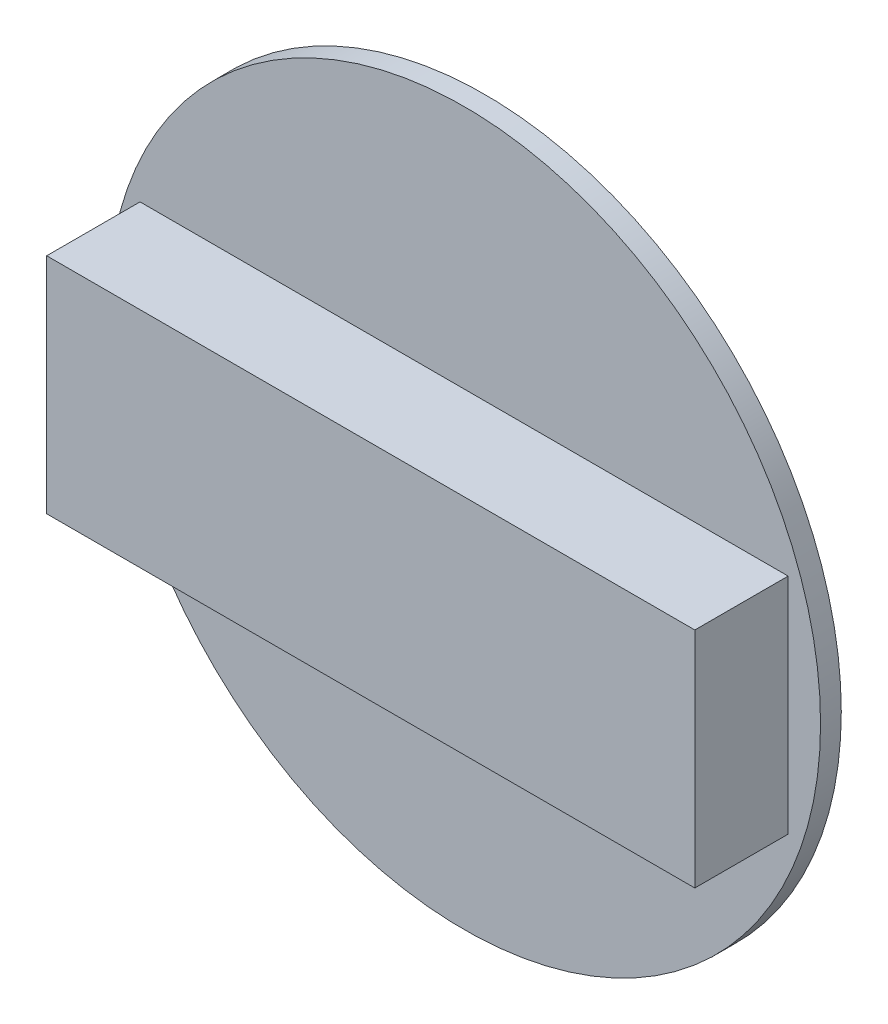
ISO-10303-21;
HEADER;
FILE_DESCRIPTION(('STEP AP214'),'2;1');
FILE_NAME('part.step','',(''),(''),'','','');
FILE_SCHEMA(('AUTOMOTIVE_DESIGN { 1 0 10303 214 1 1 1 1 }'));
ENDSEC;
DATA;
#1=APPLICATION_CONTEXT('core data for automotive mechanical design processes');
#2=APPLICATION_PROTOCOL_DEFINITION('international standard','automotive_design',2000,#1);
#3=PRODUCT_CONTEXT('',#1,'mechanical');
#4=PRODUCT('Part','Part','',(#3));
#5=PRODUCT_RELATED_PRODUCT_CATEGORY('part','',(#4));
#6=PRODUCT_DEFINITION_FORMATION('','',#4);
#7=PRODUCT_DEFINITION_CONTEXT('part definition',#1,'design');
#8=PRODUCT_DEFINITION('design','',#6,#7);
#9=PRODUCT_DEFINITION_SHAPE('','',#8);
#10=(LENGTH_UNIT() NAMED_UNIT(*) SI_UNIT(.MILLI.,.METRE.));
#11=(NAMED_UNIT(*) PLANE_ANGLE_UNIT() SI_UNIT($,.RADIAN.));
#12=(NAMED_UNIT(*) SI_UNIT($,.STERADIAN.) SOLID_ANGLE_UNIT());
#13=UNCERTAINTY_MEASURE_WITH_UNIT(LENGTH_MEASURE(1.E-05),#10,'distance_accuracy_value','');
#14=(GEOMETRIC_REPRESENTATION_CONTEXT(3) GLOBAL_UNCERTAINTY_ASSIGNED_CONTEXT((#13)) GLOBAL_UNIT_ASSIGNED_CONTEXT((#10,
#11,#12)) REPRESENTATION_CONTEXT('',''));
#15=CARTESIAN_POINT('',(0.,0.,0.));
#16=DIRECTION('',(0.,0.,1.));
#17=DIRECTION('',(1.,0.,0.));
#18=AXIS2_PLACEMENT_3D('',#15,#16,#17);
#19=CARTESIAN_POINT('',(0.,0.,1.6));
#20=DIRECTION('',(0.,0.,-1.));
#21=DIRECTION('',(-1.,0.,0.));
#22=AXIS2_PLACEMENT_3D('',#19,#20,#21);
#23=CYLINDRICAL_SURFACE('',#22,27.5);
#24=CARTESIAN_POINT('',(0.,0.,0.));
#25=DIRECTION('',(0.,0.,1.));
#26=DIRECTION('',(1.,0.,0.));
#27=AXIS2_PLACEMENT_3D('',#24,#25,#26);
#28=CIRCLE('',#27,27.5);
#29=CARTESIAN_POINT('',(-27.4431230001252,-1.76776695296639,0.));
#30=VERTEX_POINT('',#29);
#31=CARTESIAN_POINT('',(-27.4431230001252,1.76776695296635,0.));
#32=VERTEX_POINT('',#31);
#33=EDGE_CURVE('E45',#30,#32,#28,.T.);
#34=ORIENTED_EDGE('',*,*,#33,.T.);
#35=DIRECTION('',(0.,0.,1.));
#36=VECTOR('',#35,1.);
#37=CARTESIAN_POINT('',(-27.4431230001252,1.76776695296635,0.));
#38=LINE('',#37,#36);
#39=CARTESIAN_POINT('',(-27.4431230001252,1.76776695296635,1.6));
#40=VERTEX_POINT('',#39);
#41=EDGE_CURVE('E151',#32,#40,#38,.T.);
#42=ORIENTED_EDGE('',*,*,#41,.T.);
#43=CARTESIAN_POINT('',(0.,0.,1.6));
#44=DIRECTION('',(0.,0.,1.));
#45=DIRECTION('',(1.,0.,0.));
#46=AXIS2_PLACEMENT_3D('',#43,#44,#45);
#47=CIRCLE('',#46,27.5);
#48=CARTESIAN_POINT('',(-27.4431230001252,-1.76776695296639,1.6));
#49=VERTEX_POINT('',#48);
#50=EDGE_CURVE('E11',#49,#40,#47,.T.);
#51=ORIENTED_EDGE('',*,*,#50,.F.);
#52=DIRECTION('',(0.,0.,1.));
#53=VECTOR('',#52,1.);
#54=CARTESIAN_POINT('',(-27.4431230001252,-1.76776695296639,0.));
#55=LINE('',#54,#53);
#56=EDGE_CURVE('E109',#30,#49,#55,.T.);
#57=ORIENTED_EDGE('',*,*,#56,.F.);
#58=EDGE_LOOP('',(#34,#42,#51,#57));
#59=FACE_BOUND('',#58,.T.);
#60=ADVANCED_FACE('F42',(#59),#23,.T.);
#61=CARTESIAN_POINT('',(0.,0.,1.6));
#62=DIRECTION('',(0.,0.,1.));
#63=DIRECTION('',(1.,0.,0.));
#64=AXIS2_PLACEMENT_3D('',#61,#62,#63);
#65=PLANE('',#64);
#66=DIRECTION('',(-0.707106781186556,0.707106781186539,0.));
#67=VECTOR('',#66,1.);
#68=CARTESIAN_POINT('',(-27.4431230001252,1.76776695296635,1.6));
#69=LINE('',#68,#67);
#70=CARTESIAN_POINT('',(-26.3824628283454,0.707106781186547,1.6));
#71=VERTEX_POINT('',#70);
#72=EDGE_CURVE('E114',#71,#40,#69,.T.);
#73=ORIENTED_EDGE('',*,*,#72,.F.);
#74=CARTESIAN_POINT('',(-27.0895696095319,0.,1.6));
#75=DIRECTION('',(0.,0.,1.));
#76=DIRECTION('',(1.,0.,0.));
#77=AXIS2_PLACEMENT_3D('',#74,#75,#76);
#78=CIRCLE('',#77,1.00000000000002);
#79=CARTESIAN_POINT('',(-26.3824628283453,-0.707106781186554,1.6));
#80=VERTEX_POINT('',#79);
#81=EDGE_CURVE('E164',#80,#71,#78,.T.);
#82=ORIENTED_EDGE('',*,*,#81,.F.);
#83=DIRECTION('',(0.707106781186538,0.707106781186557,0.));
#84=VECTOR('',#83,1.);
#85=CARTESIAN_POINT('',(-27.4431230001252,-1.76776695296639,1.6));
#86=LINE('',#85,#84);
#87=EDGE_CURVE('E167',#49,#80,#86,.T.);
#88=ORIENTED_EDGE('',*,*,#87,.F.);
#89=ORIENTED_EDGE('',*,*,#50,.T.);
#90=EDGE_LOOP('',(#73,#82,#88,#89));
#91=FACE_BOUND('',#90,.T.);
#92=DIRECTION('',(0.,1.,0.));
#93=VECTOR('',#92,1.);
#94=CARTESIAN_POINT('',(25.,-8.62,1.6));
#95=LINE('',#94,#93);
#96=CARTESIAN_POINT('',(25.,-8.62,1.6));
#97=VERTEX_POINT('',#96);
#98=CARTESIAN_POINT('',(25.,8.62,1.6));
#99=VERTEX_POINT('',#98);
#100=EDGE_CURVE('E64',#97,#99,#95,.T.);
#101=ORIENTED_EDGE('',*,*,#100,.F.);
#102=DIRECTION('',(1.,0.,0.));
#103=VECTOR('',#102,1.);
#104=CARTESIAN_POINT('',(-25.,-8.62,1.6));
#105=LINE('',#104,#103);
#106=CARTESIAN_POINT('',(-25.,-8.62,1.6));
#107=VERTEX_POINT('',#106);
#108=EDGE_CURVE('E142',#107,#97,#105,.T.);
#109=ORIENTED_EDGE('',*,*,#108,.F.);
#110=DIRECTION('',(0.,-1.,0.));
#111=VECTOR('',#110,1.);
#112=CARTESIAN_POINT('',(-25.,-8.62,1.6));
#113=LINE('',#112,#111);
#114=CARTESIAN_POINT('',(-25.,8.62,1.6));
#115=VERTEX_POINT('',#114);
#116=EDGE_CURVE('E145',#115,#107,#113,.T.);
#117=ORIENTED_EDGE('',*,*,#116,.F.);
#118=DIRECTION('',(-1.,0.,0.));
#119=VECTOR('',#118,1.);
#120=CARTESIAN_POINT('',(-25.,8.62,1.6));
#121=LINE('',#120,#119);
#122=EDGE_CURVE('E148',#99,#115,#121,.T.);
#123=ORIENTED_EDGE('',*,*,#122,.F.);
#124=EDGE_LOOP('',(#101,#109,#117,#123));
#125=FACE_BOUND('',#124,.T.);
#126=ADVANCED_FACE('F173',(#91,#125),#65,.T.);
#127=CARTESIAN_POINT('',(0.,0.,0.));
#128=DIRECTION('',(0.,0.,1.));
#129=DIRECTION('',(1.,0.,0.));
#130=AXIS2_PLACEMENT_3D('',#127,#128,#129);
#131=PLANE('',#130);
#132=CARTESIAN_POINT('',(-27.0895696095319,0.,0.));
#133=DIRECTION('',(0.,0.,1.));
#134=DIRECTION('',(1.,0.,0.));
#135=AXIS2_PLACEMENT_3D('',#132,#133,#134);
#136=CIRCLE('',#135,1.00000000000002);
#137=CARTESIAN_POINT('',(-26.3824628283453,-0.707106781186566,0.));
#138=VERTEX_POINT('',#137);
#139=CARTESIAN_POINT('',(-26.3824628283454,0.707106781186547,0.));
#140=VERTEX_POINT('',#139);
#141=EDGE_CURVE('E56',#138,#140,#136,.T.);
#142=ORIENTED_EDGE('',*,*,#141,.T.);
#143=DIRECTION('',(-0.707106781186556,0.707106781186539,0.));
#144=VECTOR('',#143,1.);
#145=CARTESIAN_POINT('',(-27.4431230001252,1.76776695296635,0.));
#146=LINE('',#145,#144);
#147=EDGE_CURVE('E120',#140,#32,#146,.T.);
#148=ORIENTED_EDGE('',*,*,#147,.T.);
#149=ORIENTED_EDGE('',*,*,#33,.F.);
#150=DIRECTION('',(0.707106781186538,0.707106781186557,0.));
#151=VECTOR('',#150,1.);
#152=CARTESIAN_POINT('',(-27.4431230001252,-1.76776695296639,0.));
#153=LINE('',#152,#151);
#154=EDGE_CURVE('E105',#30,#138,#153,.T.);
#155=ORIENTED_EDGE('',*,*,#154,.T.);
#156=EDGE_LOOP('',(#142,#148,#149,#155));
#157=FACE_BOUND('',#156,.T.);
#158=ADVANCED_FACE('F123',(#157),#131,.F.);
#159=CARTESIAN_POINT('',(25.,-8.62,8.8));
#160=DIRECTION('',(-1.,0.,0.));
#161=DIRECTION('',(0.,0.,1.));
#162=AXIS2_PLACEMENT_3D('',#159,#160,#161);
#163=PLANE('',#162);
#164=ORIENTED_EDGE('',*,*,#100,.T.);
#165=DIRECTION('',(0.,0.,-1.));
#166=VECTOR('',#165,1.);
#167=CARTESIAN_POINT('',(25.,8.62,8.8));
#168=LINE('',#167,#166);
#169=CARTESIAN_POINT('',(25.,8.62,8.8));
#170=VERTEX_POINT('',#169);
#171=EDGE_CURVE('E125',#170,#99,#168,.T.);
#172=ORIENTED_EDGE('',*,*,#171,.F.);
#173=DIRECTION('',(0.,1.,0.));
#174=VECTOR('',#173,1.);
#175=CARTESIAN_POINT('',(25.,-8.62,8.8));
#176=LINE('',#175,#174);
#177=CARTESIAN_POINT('',(25.,-8.62,8.8));
#178=VERTEX_POINT('',#177);
#179=EDGE_CURVE('E144',#178,#170,#176,.T.);
#180=ORIENTED_EDGE('',*,*,#179,.F.);
#181=DIRECTION('',(0.,0.,-1.));
#182=VECTOR('',#181,1.);
#183=CARTESIAN_POINT('',(25.,-8.62,8.8));
#184=LINE('',#183,#182);
#185=EDGE_CURVE('E138',#178,#97,#184,.T.);
#186=ORIENTED_EDGE('',*,*,#185,.T.);
#187=EDGE_LOOP('',(#164,#172,#180,#186));
#188=FACE_BOUND('',#187,.T.);
#189=ADVANCED_FACE('F196',(#188),#163,.F.);
#190=CARTESIAN_POINT('',(-25.,8.62,8.8));
#191=DIRECTION('',(0.,-1.,0.));
#192=DIRECTION('',(0.,0.,-1.));
#193=AXIS2_PLACEMENT_3D('',#190,#191,#192);
#194=PLANE('',#193);
#195=ORIENTED_EDGE('',*,*,#122,.T.);
#196=DIRECTION('',(0.,0.,-1.));
#197=VECTOR('',#196,1.);
#198=CARTESIAN_POINT('',(-25.,8.62,8.8));
#199=LINE('',#198,#197);
#200=CARTESIAN_POINT('',(-25.,8.62,8.8));
#201=VERTEX_POINT('',#200);
#202=EDGE_CURVE('E127',#201,#115,#199,.T.);
#203=ORIENTED_EDGE('',*,*,#202,.F.);
#204=DIRECTION('',(-1.,0.,0.));
#205=VECTOR('',#204,1.);
#206=CARTESIAN_POINT('',(-25.,8.62,8.8));
#207=LINE('',#206,#205);
#208=EDGE_CURVE('E155',#170,#201,#207,.T.);
#209=ORIENTED_EDGE('',*,*,#208,.F.);
#210=ORIENTED_EDGE('',*,*,#171,.T.);
#211=EDGE_LOOP('',(#195,#203,#209,#210));
#212=FACE_BOUND('',#211,.T.);
#213=ADVANCED_FACE('F200',(#212),#194,.F.);
#214=CARTESIAN_POINT('',(-25.,-8.62,8.8));
#215=DIRECTION('',(1.,0.,0.));
#216=DIRECTION('',(0.,0.,-1.));
#217=AXIS2_PLACEMENT_3D('',#214,#215,#216);
#218=PLANE('',#217);
#219=ORIENTED_EDGE('',*,*,#116,.T.);
#220=DIRECTION('',(0.,0.,-1.));
#221=VECTOR('',#220,1.);
#222=CARTESIAN_POINT('',(-25.,-8.62,8.8));
#223=LINE('',#222,#221);
#224=CARTESIAN_POINT('',(-25.,-8.62,8.8));
#225=VERTEX_POINT('',#224);
#226=EDGE_CURVE('E133',#225,#107,#223,.T.);
#227=ORIENTED_EDGE('',*,*,#226,.F.);
#228=DIRECTION('',(0.,-1.,0.));
#229=VECTOR('',#228,1.);
#230=CARTESIAN_POINT('',(-25.,-8.62,8.8));
#231=LINE('',#230,#229);
#232=EDGE_CURVE('E153',#201,#225,#231,.T.);
#233=ORIENTED_EDGE('',*,*,#232,.F.);
#234=ORIENTED_EDGE('',*,*,#202,.T.);
#235=EDGE_LOOP('',(#219,#227,#233,#234));
#236=FACE_BOUND('',#235,.T.);
#237=ADVANCED_FACE('F204',(#236),#218,.F.);
#238=CARTESIAN_POINT('',(-25.,-8.62,8.8));
#239=DIRECTION('',(0.,1.,0.));
#240=DIRECTION('',(0.,0.,1.));
#241=AXIS2_PLACEMENT_3D('',#238,#239,#240);
#242=PLANE('',#241);
#243=ORIENTED_EDGE('',*,*,#108,.T.);
#244=ORIENTED_EDGE('',*,*,#185,.F.);
#245=DIRECTION('',(1.,0.,0.));
#246=VECTOR('',#245,1.);
#247=CARTESIAN_POINT('',(-25.,-8.62,8.8));
#248=LINE('',#247,#246);
#249=EDGE_CURVE('E141',#225,#178,#248,.T.);
#250=ORIENTED_EDGE('',*,*,#249,.F.);
#251=ORIENTED_EDGE('',*,*,#226,.T.);
#252=EDGE_LOOP('',(#243,#244,#250,#251));
#253=FACE_BOUND('',#252,.T.);
#254=ADVANCED_FACE('F186',(#253),#242,.F.);
#255=CARTESIAN_POINT('',(0.,0.,8.8));
#256=DIRECTION('',(0.,0.,-1.));
#257=DIRECTION('',(-1.,0.,0.));
#258=AXIS2_PLACEMENT_3D('',#255,#256,#257);
#259=PLANE('',#258);
#260=ORIENTED_EDGE('',*,*,#179,.T.);
#261=ORIENTED_EDGE('',*,*,#208,.T.);
#262=ORIENTED_EDGE('',*,*,#232,.T.);
#263=ORIENTED_EDGE('',*,*,#249,.T.);
#264=EDGE_LOOP('',(#260,#261,#262,#263));
#265=FACE_BOUND('',#264,.T.);
#266=ADVANCED_FACE('F178',(#265),#259,.F.);
#267=CARTESIAN_POINT('',(-27.4431230001252,1.76776695296635,0.));
#268=DIRECTION('',(0.707106781186539,0.707106781186556,0.));
#269=DIRECTION('',(-0.707106781186556,0.707106781186539,0.));
#270=AXIS2_PLACEMENT_3D('',#267,#268,#269);
#271=PLANE('',#270);
#272=ORIENTED_EDGE('',*,*,#72,.T.);
#273=ORIENTED_EDGE('',*,*,#41,.F.);
#274=ORIENTED_EDGE('',*,*,#147,.F.);
#275=DIRECTION('',(0.,0.,1.));
#276=VECTOR('',#275,1.);
#277=CARTESIAN_POINT('',(-26.3824628283454,0.707106781186547,0.));
#278=LINE('',#277,#276);
#279=EDGE_CURVE('E160',#140,#71,#278,.T.);
#280=ORIENTED_EDGE('',*,*,#279,.T.);
#281=EDGE_LOOP('',(#272,#273,#274,#280));
#282=FACE_BOUND('',#281,.T.);
#283=ADVANCED_FACE('F176',(#282),#271,.F.);
#284=CARTESIAN_POINT('',(-27.0895696095319,0.,0.));
#285=DIRECTION('',(0.,0.,1.));
#286=DIRECTION('',(1.,0.,0.));
#287=AXIS2_PLACEMENT_3D('',#284,#285,#286);
#288=CYLINDRICAL_SURFACE('',#287,1.00000000000002);
#289=ORIENTED_EDGE('',*,*,#81,.T.);
#290=ORIENTED_EDGE('',*,*,#279,.F.);
#291=ORIENTED_EDGE('',*,*,#141,.F.);
#292=DIRECTION('',(0.,0.,1.));
#293=VECTOR('',#292,1.);
#294=CARTESIAN_POINT('',(-26.3824628283453,-0.707106781186554,0.));
#295=LINE('',#294,#293);
#296=EDGE_CURVE('E111',#138,#80,#295,.T.);
#297=ORIENTED_EDGE('',*,*,#296,.T.);
#298=EDGE_LOOP('',(#289,#290,#291,#297));
#299=FACE_BOUND('',#298,.T.);
#300=ADVANCED_FACE('F174',(#299),#288,.F.);
#301=CARTESIAN_POINT('',(-27.4431230001252,-1.76776695296639,0.));
#302=DIRECTION('',(0.707106781186557,-0.707106781186538,0.));
#303=DIRECTION('',(0.707106781186538,0.707106781186557,0.));
#304=AXIS2_PLACEMENT_3D('',#301,#302,#303);
#305=PLANE('',#304);
#306=ORIENTED_EDGE('',*,*,#87,.T.);
#307=ORIENTED_EDGE('',*,*,#296,.F.);
#308=ORIENTED_EDGE('',*,*,#154,.F.);
#309=ORIENTED_EDGE('',*,*,#56,.T.);
#310=EDGE_LOOP('',(#306,#307,#308,#309));
#311=FACE_BOUND('',#310,.T.);
#312=ADVANCED_FACE('F108',(#311),#305,.F.);
#313=CLOSED_SHELL('',(#60,#126,#158,#189,#213,#237,#254,#266,#283,#300,#312));
#314=MANIFOLD_SOLID_BREP('B2',#313);
#315=ADVANCED_BREP_SHAPE_REPRESENTATION('',(#18,#314),#14);
#316=SHAPE_DEFINITION_REPRESENTATION(#9,#315);
ENDSEC;
END-ISO-10303-21;
